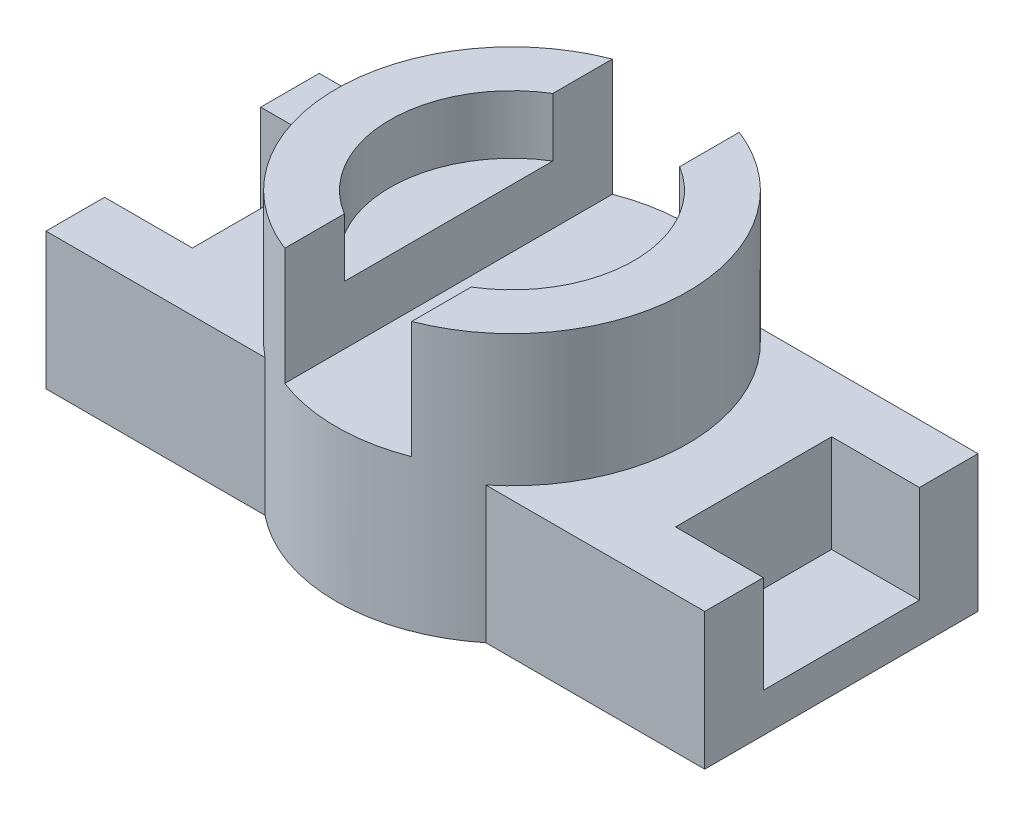
ISO-10303-21;
HEADER;
FILE_DESCRIPTION(('STEP AP214'),'2;1');
FILE_NAME('part.step','',(''),(''),'','','');
FILE_SCHEMA(('AUTOMOTIVE_DESIGN { 1 0 10303 214 1 1 1 1 }'));
ENDSEC;
DATA;
#1=APPLICATION_CONTEXT('core data for automotive mechanical design processes');
#2=APPLICATION_PROTOCOL_DEFINITION('international standard','automotive_design',2000,#1);
#3=PRODUCT_CONTEXT('',#1,'mechanical');
#4=PRODUCT('Part','Part','',(#3));
#5=PRODUCT_RELATED_PRODUCT_CATEGORY('part','',(#4));
#6=PRODUCT_DEFINITION_FORMATION('','',#4);
#7=PRODUCT_DEFINITION_CONTEXT('part definition',#1,'design');
#8=PRODUCT_DEFINITION('design','',#6,#7);
#9=PRODUCT_DEFINITION_SHAPE('','',#8);
#10=(LENGTH_UNIT() NAMED_UNIT(*) SI_UNIT(.MILLI.,.METRE.));
#11=(NAMED_UNIT(*) PLANE_ANGLE_UNIT() SI_UNIT($,.RADIAN.));
#12=(NAMED_UNIT(*) SI_UNIT($,.STERADIAN.) SOLID_ANGLE_UNIT());
#13=UNCERTAINTY_MEASURE_WITH_UNIT(LENGTH_MEASURE(1.E-05),#10,'distance_accuracy_value','');
#14=(GEOMETRIC_REPRESENTATION_CONTEXT(3) GLOBAL_UNCERTAINTY_ASSIGNED_CONTEXT((#13)) GLOBAL_UNIT_ASSIGNED_CONTEXT((#10,
#11,#12)) REPRESENTATION_CONTEXT('',''));
#15=CARTESIAN_POINT('',(0.,0.,0.));
#16=DIRECTION('',(0.,0.,1.));
#17=DIRECTION('',(1.,0.,0.));
#18=AXIS2_PLACEMENT_3D('',#15,#16,#17);
#19=CARTESIAN_POINT('',(0.,55.,0.));
#20=DIRECTION('',(0.,-1.,0.));
#21=DIRECTION('',(0.,0.,-1.));
#22=AXIS2_PLACEMENT_3D('',#19,#20,#21);
#23=CYLINDRICAL_SURFACE('',#22,36.);
#24=CARTESIAN_POINT('',(0.,0.,0.));
#25=DIRECTION('',(0.,1.,0.));
#26=DIRECTION('',(0.,0.,1.));
#27=AXIS2_PLACEMENT_3D('',#24,#25,#26);
#28=CIRCLE('',#27,36.);
#29=CARTESIAN_POINT('',(22.6274169979695,0.,-28.));
#30=VERTEX_POINT('',#29);
#31=CARTESIAN_POINT('',(-22.6274169979695,0.,-28.));
#32=VERTEX_POINT('',#31);
#33=EDGE_CURVE('E383',#30,#32,#28,.T.);
#34=ORIENTED_EDGE('',*,*,#33,.T.);
#35=DIRECTION('',(0.,-1.,0.));
#36=VECTOR('',#35,1.);
#37=CARTESIAN_POINT('',(-22.6274169979695,28.,-28.));
#38=LINE('',#37,#36);
#39=CARTESIAN_POINT('',(-22.6274169979695,28.,-28.));
#40=VERTEX_POINT('',#39);
#41=EDGE_CURVE('E372',#40,#32,#38,.T.);
#42=ORIENTED_EDGE('',*,*,#41,.F.);
#43=CARTESIAN_POINT('',(0.,28.,0.));
#44=DIRECTION('',(0.,1.,0.));
#45=DIRECTION('',(0.,0.,1.));
#46=AXIS2_PLACEMENT_3D('',#43,#44,#45);
#47=CIRCLE('',#46,36.);
#48=CARTESIAN_POINT('',(-22.6274169979695,28.,28.));
#49=VERTEX_POINT('',#48);
#50=EDGE_CURVE('E337',#40,#49,#47,.T.);
#51=ORIENTED_EDGE('',*,*,#50,.T.);
#52=DIRECTION('',(0.,-1.,0.));
#53=VECTOR('',#52,1.);
#54=CARTESIAN_POINT('',(-22.6274169979695,28.,28.));
#55=LINE('',#54,#53);
#56=CARTESIAN_POINT('',(-22.6274169979695,0.,28.));
#57=VERTEX_POINT('',#56);
#58=EDGE_CURVE('E352',#49,#57,#55,.T.);
#59=ORIENTED_EDGE('',*,*,#58,.T.);
#60=CARTESIAN_POINT('',(22.6274169979695,0.,28.));
#61=VERTEX_POINT('',#60);
#62=EDGE_CURVE('E376',#57,#61,#28,.T.);
#63=ORIENTED_EDGE('',*,*,#62,.T.);
#64=DIRECTION('',(0.,-1.,0.));
#65=VECTOR('',#64,1.);
#66=CARTESIAN_POINT('',(22.6274169979695,28.,28.));
#67=LINE('',#66,#65);
#68=CARTESIAN_POINT('',(22.6274169979695,28.,28.));
#69=VERTEX_POINT('',#68);
#70=EDGE_CURVE('E422',#69,#61,#67,.T.);
#71=ORIENTED_EDGE('',*,*,#70,.F.);
#72=CARTESIAN_POINT('',(0.,28.,0.));
#73=DIRECTION('',(0.,1.,0.));
#74=DIRECTION('',(0.,0.,1.));
#75=AXIS2_PLACEMENT_3D('',#72,#73,#74);
#76=CIRCLE('',#75,36.);
#77=CARTESIAN_POINT('',(22.6274169979695,28.,-28.));
#78=VERTEX_POINT('',#77);
#79=EDGE_CURVE('E386',#69,#78,#76,.T.);
#80=ORIENTED_EDGE('',*,*,#79,.T.);
#81=DIRECTION('',(0.,-1.,0.));
#82=VECTOR('',#81,1.);
#83=CARTESIAN_POINT('',(22.6274169979695,28.,-28.));
#84=LINE('',#83,#82);
#85=EDGE_CURVE('E402',#78,#30,#84,.T.);
#86=ORIENTED_EDGE('',*,*,#85,.T.);
#87=EDGE_LOOP('',(#34,#42,#51,#59,#63,#71,#80,#86));
#88=FACE_BOUND('',#87,.T.);
#89=DIRECTION('',(0.,-1.,0.));
#90=VECTOR('',#89,1.);
#91=CARTESIAN_POINT('',(13.,55.,-33.570820663189));
#92=LINE('',#91,#90);
#93=CARTESIAN_POINT('',(13.,55.,-33.570820663189));
#94=VERTEX_POINT('',#93);
#95=CARTESIAN_POINT('',(13.,31.,-33.570820663189));
#96=VERTEX_POINT('',#95);
#97=EDGE_CURVE('E323',#94,#96,#92,.T.);
#98=ORIENTED_EDGE('',*,*,#97,.F.);
#99=CARTESIAN_POINT('',(0.,55.,0.));
#100=DIRECTION('',(0.,1.,0.));
#101=DIRECTION('',(0.,0.,1.));
#102=AXIS2_PLACEMENT_3D('',#99,#100,#101);
#103=CIRCLE('',#102,36.);
#104=CARTESIAN_POINT('',(13.,55.,33.5708206631891));
#105=VERTEX_POINT('',#104);
#106=EDGE_CURVE('E377',#105,#94,#103,.T.);
#107=ORIENTED_EDGE('',*,*,#106,.F.);
#108=DIRECTION('',(0.,-1.,0.));
#109=VECTOR('',#108,1.);
#110=CARTESIAN_POINT('',(13.,55.,33.5708206631891));
#111=LINE('',#110,#109);
#112=CARTESIAN_POINT('',(13.,31.,33.570820663189));
#113=VERTEX_POINT('',#112);
#114=EDGE_CURVE('E320',#113,#105,#111,.F.);
#115=ORIENTED_EDGE('',*,*,#114,.F.);
#116=CARTESIAN_POINT('',(0.,31.,0.));
#117=DIRECTION('',(0.,1.,0.));
#118=DIRECTION('',(0.,0.,1.));
#119=AXIS2_PLACEMENT_3D('',#116,#117,#118);
#120=CIRCLE('',#119,36.);
#121=CARTESIAN_POINT('',(-13.,31.,33.570820663189));
#122=VERTEX_POINT('',#121);
#123=EDGE_CURVE('E51',#122,#113,#120,.T.);
#124=ORIENTED_EDGE('',*,*,#123,.F.);
#125=DIRECTION('',(0.,-1.,0.));
#126=VECTOR('',#125,1.);
#127=CARTESIAN_POINT('',(-13.,55.,33.570820663189));
#128=LINE('',#127,#126);
#129=CARTESIAN_POINT('',(-13.,55.,33.570820663189));
#130=VERTEX_POINT('',#129);
#131=EDGE_CURVE('E306',#122,#130,#128,.F.);
#132=ORIENTED_EDGE('',*,*,#131,.T.);
#133=CARTESIAN_POINT('',(-13.,55.,-33.570820663189));
#134=VERTEX_POINT('',#133);
#135=EDGE_CURVE('E382',#134,#130,#103,.T.);
#136=ORIENTED_EDGE('',*,*,#135,.F.);
#137=DIRECTION('',(0.,-1.,0.));
#138=VECTOR('',#137,1.);
#139=CARTESIAN_POINT('',(-13.,55.,-33.570820663189));
#140=LINE('',#139,#138);
#141=CARTESIAN_POINT('',(-13.,31.,-33.570820663189));
#142=VERTEX_POINT('',#141);
#143=EDGE_CURVE('E310',#134,#142,#140,.T.);
#144=ORIENTED_EDGE('',*,*,#143,.T.);
#145=EDGE_CURVE('E11',#96,#142,#120,.T.);
#146=ORIENTED_EDGE('',*,*,#145,.F.);
#147=EDGE_LOOP('',(#98,#107,#115,#124,#132,#136,#144,#146));
#148=FACE_BOUND('',#147,.T.);
#149=ADVANCED_FACE('F47',(#88,#148),#23,.T.);
#150=CARTESIAN_POINT('',(0.,55.,0.));
#151=DIRECTION('',(0.,1.,0.));
#152=DIRECTION('',(0.,0.,1.));
#153=AXIS2_PLACEMENT_3D('',#150,#151,#152);
#154=PLANE('',#153);
#155=ORIENTED_EDGE('',*,*,#106,.T.);
#156=DIRECTION('',(0.,0.,-1.));
#157=VECTOR('',#156,1.);
#158=CARTESIAN_POINT('',(13.,55.,42.8234924623116));
#159=LINE('',#158,#157);
#160=CARTESIAN_POINT('',(13.,55.,-21.3541565040626));
#161=VERTEX_POINT('',#160);
#162=EDGE_CURVE('E280',#161,#94,#159,.T.);
#163=ORIENTED_EDGE('',*,*,#162,.F.);
#164=CARTESIAN_POINT('',(0.,55.,0.));
#165=DIRECTION('',(0.,1.,0.));
#166=DIRECTION('',(0.,0.,1.));
#167=AXIS2_PLACEMENT_3D('',#164,#165,#166);
#168=CIRCLE('',#167,25.);
#169=CARTESIAN_POINT('',(13.,55.,21.3541565040626));
#170=VERTEX_POINT('',#169);
#171=EDGE_CURVE('E333',#170,#161,#168,.T.);
#172=ORIENTED_EDGE('',*,*,#171,.F.);
#173=EDGE_CURVE('E283',#105,#170,#159,.T.);
#174=ORIENTED_EDGE('',*,*,#173,.F.);
#175=EDGE_LOOP('',(#155,#163,#172,#174));
#176=FACE_BOUND('',#175,.T.);
#177=ADVANCED_FACE('F449',(#176),#154,.T.);
#178=CARTESIAN_POINT('',(0.,43.,0.));
#179=DIRECTION('',(0.,1.,0.));
#180=DIRECTION('',(0.,0.,1.));
#181=AXIS2_PLACEMENT_3D('',#178,#179,#180);
#182=CYLINDRICAL_SURFACE('',#181,25.);
#183=DIRECTION('',(0.,1.,0.));
#184=VECTOR('',#183,1.);
#185=CARTESIAN_POINT('',(13.,43.,21.3541565040626));
#186=LINE('',#185,#184);
#187=CARTESIAN_POINT('',(13.,43.,21.3541565040626));
#188=VERTEX_POINT('',#187);
#189=EDGE_CURVE('E317',#170,#188,#186,.F.);
#190=ORIENTED_EDGE('',*,*,#189,.F.);
#191=ORIENTED_EDGE('',*,*,#171,.T.);
#192=DIRECTION('',(0.,1.,0.));
#193=VECTOR('',#192,1.);
#194=CARTESIAN_POINT('',(13.,43.,-21.3541565040626));
#195=LINE('',#194,#193);
#196=CARTESIAN_POINT('',(13.,43.,-21.3541565040626));
#197=VERTEX_POINT('',#196);
#198=EDGE_CURVE('E314',#197,#161,#195,.T.);
#199=ORIENTED_EDGE('',*,*,#198,.F.);
#200=CARTESIAN_POINT('',(0.,43.,0.));
#201=DIRECTION('',(0.,1.,0.));
#202=DIRECTION('',(0.,0.,1.));
#203=AXIS2_PLACEMENT_3D('',#200,#201,#202);
#204=CIRCLE('',#203,25.);
#205=EDGE_CURVE('E327',#188,#197,#204,.T.);
#206=ORIENTED_EDGE('',*,*,#205,.F.);
#207=EDGE_LOOP('',(#190,#191,#199,#206));
#208=FACE_BOUND('',#207,.T.);
#209=ADVANCED_FACE('F506',(#208),#182,.F.);
#210=CARTESIAN_POINT('',(0.,43.,0.));
#211=DIRECTION('',(0.,1.,0.));
#212=DIRECTION('',(0.,0.,1.));
#213=AXIS2_PLACEMENT_3D('',#210,#211,#212);
#214=PLANE('',#213);
#215=ORIENTED_EDGE('',*,*,#205,.T.);
#216=DIRECTION('',(0.,0.,1.));
#217=VECTOR('',#216,1.);
#218=CARTESIAN_POINT('',(13.,43.,0.));
#219=LINE('',#218,#217);
#220=EDGE_CURVE('E428',#197,#188,#219,.T.);
#221=ORIENTED_EDGE('',*,*,#220,.T.);
#222=EDGE_LOOP('',(#215,#221));
#223=FACE_BOUND('',#222,.T.);
#224=ADVANCED_FACE('F499',(#223),#214,.T.);
#225=CARTESIAN_POINT('',(0.,28.,28.));
#226=DIRECTION('',(0.,0.,-1.));
#227=DIRECTION('',(-1.,0.,0.));
#228=AXIS2_PLACEMENT_3D('',#225,#226,#227);
#229=PLANE('',#228);
#230=DIRECTION('',(1.,0.,0.));
#231=VECTOR('',#230,1.);
#232=CARTESIAN_POINT('',(0.,0.,28.));
#233=LINE('',#232,#231);
#234=CARTESIAN_POINT('',(67.5,0.,28.));
#235=VERTEX_POINT('',#234);
#236=EDGE_CURVE('E381',#61,#235,#233,.T.);
#237=ORIENTED_EDGE('',*,*,#236,.T.);
#238=DIRECTION('',(0.,-1.,0.));
#239=VECTOR('',#238,1.);
#240=CARTESIAN_POINT('',(67.5,28.,28.));
#241=LINE('',#240,#239);
#242=CARTESIAN_POINT('',(67.5,28.,28.));
#243=VERTEX_POINT('',#242);
#244=EDGE_CURVE('E418',#243,#235,#241,.T.);
#245=ORIENTED_EDGE('',*,*,#244,.F.);
#246=DIRECTION('',(1.,0.,0.));
#247=VECTOR('',#246,1.);
#248=CARTESIAN_POINT('',(0.,28.,28.));
#249=LINE('',#248,#247);
#250=EDGE_CURVE('E389',#69,#243,#249,.T.);
#251=ORIENTED_EDGE('',*,*,#250,.F.);
#252=ORIENTED_EDGE('',*,*,#70,.T.);
#253=EDGE_LOOP('',(#237,#245,#251,#252));
#254=FACE_BOUND('',#253,.T.);
#255=ADVANCED_FACE('F49',(#254),#229,.F.);
#256=CARTESIAN_POINT('',(67.5,28.,0.));
#257=DIRECTION('',(-1.,0.,0.));
#258=DIRECTION('',(0.,0.,1.));
#259=AXIS2_PLACEMENT_3D('',#256,#257,#258);
#260=PLANE('',#259);
#261=DIRECTION('',(0.,0.,-1.));
#262=VECTOR('',#261,1.);
#263=CARTESIAN_POINT('',(67.5,28.,0.));
#264=LINE('',#263,#262);
#265=CARTESIAN_POINT('',(67.5000000000001,28.,-16.));
#266=VERTEX_POINT('',#265);
#267=CARTESIAN_POINT('',(67.4999999999999,28.,-28.));
#268=VERTEX_POINT('',#267);
#269=EDGE_CURVE('E393',#266,#268,#264,.T.);
#270=ORIENTED_EDGE('',*,*,#269,.F.);
#271=DIRECTION('',(0.,1.,0.));
#272=VECTOR('',#271,1.);
#273=CARTESIAN_POINT('',(67.5000000000001,8.,-16.));
#274=LINE('',#273,#272);
#275=CARTESIAN_POINT('',(67.5000000000001,8.,-16.));
#276=VERTEX_POINT('',#275);
#277=EDGE_CURVE('E252',#276,#266,#274,.T.);
#278=ORIENTED_EDGE('',*,*,#277,.F.);
#279=DIRECTION('',(0.,0.,-1.));
#280=VECTOR('',#279,1.);
#281=CARTESIAN_POINT('',(67.5000000000001,8.,-16.));
#282=LINE('',#281,#280);
#283=CARTESIAN_POINT('',(67.5000000000001,8.,16.));
#284=VERTEX_POINT('',#283);
#285=EDGE_CURVE('E244',#284,#276,#282,.T.);
#286=ORIENTED_EDGE('',*,*,#285,.F.);
#287=DIRECTION('',(0.,1.,0.));
#288=VECTOR('',#287,1.);
#289=CARTESIAN_POINT('',(67.5000000000001,8.,16.));
#290=LINE('',#289,#288);
#291=CARTESIAN_POINT('',(67.5000000000001,28.,16.));
#292=VERTEX_POINT('',#291);
#293=EDGE_CURVE('E248',#284,#292,#290,.T.);
#294=ORIENTED_EDGE('',*,*,#293,.T.);
#295=EDGE_CURVE('E394',#243,#292,#264,.T.);
#296=ORIENTED_EDGE('',*,*,#295,.F.);
#297=ORIENTED_EDGE('',*,*,#244,.T.);
#298=DIRECTION('',(0.,0.,-1.));
#299=VECTOR('',#298,1.);
#300=CARTESIAN_POINT('',(67.5,0.,0.));
#301=LINE('',#300,#299);
#302=CARTESIAN_POINT('',(67.4999999999999,0.,-28.));
#303=VERTEX_POINT('',#302);
#304=EDGE_CURVE('E405',#235,#303,#301,.T.);
#305=ORIENTED_EDGE('',*,*,#304,.T.);
#306=DIRECTION('',(0.,-1.,0.));
#307=VECTOR('',#306,1.);
#308=CARTESIAN_POINT('',(67.4999999999999,28.,-28.));
#309=LINE('',#308,#307);
#310=EDGE_CURVE('E415',#268,#303,#309,.T.);
#311=ORIENTED_EDGE('',*,*,#310,.F.);
#312=EDGE_LOOP('',(#270,#278,#286,#294,#296,#297,#305,#311));
#313=FACE_BOUND('',#312,.T.);
#314=ADVANCED_FACE('F529',(#313),#260,.F.);
#315=CARTESIAN_POINT('',(0.,28.,-28.));
#316=DIRECTION('',(0.,0.,-1.));
#317=DIRECTION('',(-1.,0.,0.));
#318=AXIS2_PLACEMENT_3D('',#315,#316,#317);
#319=PLANE('',#318);
#320=DIRECTION('',(1.,0.,0.));
#321=VECTOR('',#320,1.);
#322=CARTESIAN_POINT('',(0.,0.,-28.));
#323=LINE('',#322,#321);
#324=EDGE_CURVE('E390',#30,#303,#323,.T.);
#325=ORIENTED_EDGE('',*,*,#324,.F.);
#326=ORIENTED_EDGE('',*,*,#85,.F.);
#327=DIRECTION('',(1.,0.,0.));
#328=VECTOR('',#327,1.);
#329=CARTESIAN_POINT('',(0.,28.,-28.));
#330=LINE('',#329,#328);
#331=EDGE_CURVE('E398',#78,#268,#330,.T.);
#332=ORIENTED_EDGE('',*,*,#331,.T.);
#333=ORIENTED_EDGE('',*,*,#310,.T.);
#334=EDGE_LOOP('',(#325,#326,#332,#333));
#335=FACE_BOUND('',#334,.T.);
#336=ADVANCED_FACE('F523',(#335),#319,.T.);
#337=CARTESIAN_POINT('',(0.,28.,0.));
#338=DIRECTION('',(0.,1.,0.));
#339=DIRECTION('',(0.,0.,1.));
#340=AXIS2_PLACEMENT_3D('',#337,#338,#339);
#341=PLANE('',#340);
#342=DIRECTION('',(-1.,0.,0.));
#343=VECTOR('',#342,1.);
#344=CARTESIAN_POINT('',(67.5000000000001,28.,-16.));
#345=LINE('',#344,#343);
#346=CARTESIAN_POINT('',(49.5000000000001,28.,-16.));
#347=VERTEX_POINT('',#346);
#348=EDGE_CURVE('E63',#266,#347,#345,.T.);
#349=ORIENTED_EDGE('',*,*,#348,.F.);
#350=ORIENTED_EDGE('',*,*,#269,.T.);
#351=ORIENTED_EDGE('',*,*,#331,.F.);
#352=ORIENTED_EDGE('',*,*,#79,.F.);
#353=ORIENTED_EDGE('',*,*,#250,.T.);
#354=ORIENTED_EDGE('',*,*,#295,.T.);
#355=DIRECTION('',(1.,0.,0.));
#356=VECTOR('',#355,1.);
#357=CARTESIAN_POINT('',(67.5000000000001,28.,16.));
#358=LINE('',#357,#356);
#359=CARTESIAN_POINT('',(49.5,28.,16.));
#360=VERTEX_POINT('',#359);
#361=EDGE_CURVE('E255',#360,#292,#358,.T.);
#362=ORIENTED_EDGE('',*,*,#361,.F.);
#363=DIRECTION('',(0.,0.,1.));
#364=VECTOR('',#363,1.);
#365=CARTESIAN_POINT('',(49.5000000000001,28.,-16.));
#366=LINE('',#365,#364);
#367=EDGE_CURVE('E258',#347,#360,#366,.T.);
#368=ORIENTED_EDGE('',*,*,#367,.F.);
#369=EDGE_LOOP('',(#349,#350,#351,#352,#353,#354,#362,#368));
#370=FACE_BOUND('',#369,.T.);
#371=ADVANCED_FACE('F519',(#370),#341,.T.);
#372=CARTESIAN_POINT('',(0.,0.,0.));
#373=DIRECTION('',(0.,1.,0.));
#374=DIRECTION('',(0.,0.,1.));
#375=AXIS2_PLACEMENT_3D('',#372,#373,#374);
#376=PLANE('',#375);
#377=ORIENTED_EDGE('',*,*,#236,.F.);
#378=ORIENTED_EDGE('',*,*,#62,.F.);
#379=DIRECTION('',(1.,0.,0.));
#380=VECTOR('',#379,1.);
#381=CARTESIAN_POINT('',(0.,0.,28.));
#382=LINE('',#381,#380);
#383=CARTESIAN_POINT('',(-67.5,0.,28.));
#384=VERTEX_POINT('',#383);
#385=EDGE_CURVE('E341',#384,#57,#382,.T.);
#386=ORIENTED_EDGE('',*,*,#385,.F.);
#387=DIRECTION('',(0.,0.,-1.));
#388=VECTOR('',#387,1.);
#389=CARTESIAN_POINT('',(-67.5,0.,0.));
#390=LINE('',#389,#388);
#391=CARTESIAN_POINT('',(-67.5,0.,-28.));
#392=VERTEX_POINT('',#391);
#393=EDGE_CURVE('E356',#384,#392,#390,.T.);
#394=ORIENTED_EDGE('',*,*,#393,.T.);
#395=DIRECTION('',(1.,0.,0.));
#396=VECTOR('',#395,1.);
#397=CARTESIAN_POINT('',(0.,0.,-28.));
#398=LINE('',#397,#396);
#399=EDGE_CURVE('E331',#392,#32,#398,.T.);
#400=ORIENTED_EDGE('',*,*,#399,.T.);
#401=ORIENTED_EDGE('',*,*,#33,.F.);
#402=ORIENTED_EDGE('',*,*,#324,.T.);
#403=ORIENTED_EDGE('',*,*,#304,.F.);
#404=EDGE_LOOP('',(#377,#378,#386,#394,#400,#401,#402,#403));
#405=FACE_BOUND('',#404,.T.);
#406=ADVANCED_FACE('F522',(#405),#376,.F.);
#407=DIRECTION('',(0.,0.,-1.));
#408=VECTOR('',#407,1.);
#409=CARTESIAN_POINT('',(-13.,55.,42.8234924623116));
#410=LINE('',#409,#408);
#411=CARTESIAN_POINT('',(-13.,55.,-21.3541565040626));
#412=VERTEX_POINT('',#411);
#413=EDGE_CURVE('E285',#412,#134,#410,.T.);
#414=ORIENTED_EDGE('',*,*,#413,.T.);
#415=ORIENTED_EDGE('',*,*,#135,.T.);
#416=CARTESIAN_POINT('',(-13.,55.,21.3541565040626));
#417=VERTEX_POINT('',#416);
#418=EDGE_CURVE('E289',#130,#417,#410,.T.);
#419=ORIENTED_EDGE('',*,*,#418,.T.);
#420=EDGE_CURVE('E326',#412,#417,#168,.T.);
#421=ORIENTED_EDGE('',*,*,#420,.F.);
#422=EDGE_LOOP('',(#414,#415,#419,#421));
#423=FACE_BOUND('',#422,.T.);
#424=ADVANCED_FACE('F487',(#423),#154,.T.);
#425=CARTESIAN_POINT('',(0.,28.,-28.));
#426=DIRECTION('',(0.,0.,-1.));
#427=DIRECTION('',(-1.,0.,0.));
#428=AXIS2_PLACEMENT_3D('',#425,#426,#427);
#429=PLANE('',#428);
#430=ORIENTED_EDGE('',*,*,#399,.F.);
#431=DIRECTION('',(0.,-1.,0.));
#432=VECTOR('',#431,1.);
#433=CARTESIAN_POINT('',(-67.5,28.,-28.));
#434=LINE('',#433,#432);
#435=CARTESIAN_POINT('',(-67.5,28.,-28.));
#436=VERTEX_POINT('',#435);
#437=EDGE_CURVE('E369',#436,#392,#434,.T.);
#438=ORIENTED_EDGE('',*,*,#437,.F.);
#439=DIRECTION('',(1.,0.,0.));
#440=VECTOR('',#439,1.);
#441=CARTESIAN_POINT('',(0.,28.,-28.));
#442=LINE('',#441,#440);
#443=EDGE_CURVE('E340',#436,#40,#442,.T.);
#444=ORIENTED_EDGE('',*,*,#443,.T.);
#445=ORIENTED_EDGE('',*,*,#41,.T.);
#446=EDGE_LOOP('',(#430,#438,#444,#445));
#447=FACE_BOUND('',#446,.T.);
#448=ADVANCED_FACE('F560',(#447),#429,.T.);
#449=CARTESIAN_POINT('',(-67.5,28.,0.));
#450=DIRECTION('',(-1.,0.,0.));
#451=DIRECTION('',(0.,0.,1.));
#452=AXIS2_PLACEMENT_3D('',#449,#450,#451);
#453=PLANE('',#452);
#454=DIRECTION('',(0.,1.,0.));
#455=VECTOR('',#454,1.);
#456=CARTESIAN_POINT('',(-67.5,8.,-16.));
#457=LINE('',#456,#455);
#458=CARTESIAN_POINT('',(-67.5,8.,-16.));
#459=VERTEX_POINT('',#458);
#460=CARTESIAN_POINT('',(-67.5,28.,-16.));
#461=VERTEX_POINT('',#460);
#462=EDGE_CURVE('E294',#459,#461,#457,.T.);
#463=ORIENTED_EDGE('',*,*,#462,.T.);
#464=DIRECTION('',(0.,0.,-1.));
#465=VECTOR('',#464,1.);
#466=CARTESIAN_POINT('',(-67.5,28.,0.));
#467=LINE('',#466,#465);
#468=EDGE_CURVE('E345',#461,#436,#467,.T.);
#469=ORIENTED_EDGE('',*,*,#468,.T.);
#470=ORIENTED_EDGE('',*,*,#437,.T.);
#471=ORIENTED_EDGE('',*,*,#393,.F.);
#472=DIRECTION('',(0.,-1.,0.));
#473=VECTOR('',#472,1.);
#474=CARTESIAN_POINT('',(-67.5,28.,28.));
#475=LINE('',#474,#473);
#476=CARTESIAN_POINT('',(-67.5,28.,28.));
#477=VERTEX_POINT('',#476);
#478=EDGE_CURVE('E366',#477,#384,#475,.T.);
#479=ORIENTED_EDGE('',*,*,#478,.F.);
#480=CARTESIAN_POINT('',(-67.5,28.,16.));
#481=VERTEX_POINT('',#480);
#482=EDGE_CURVE('E231',#477,#481,#467,.T.);
#483=ORIENTED_EDGE('',*,*,#482,.T.);
#484=DIRECTION('',(0.,1.,0.));
#485=VECTOR('',#484,1.);
#486=CARTESIAN_POINT('',(-67.5,8.,16.));
#487=LINE('',#486,#485);
#488=CARTESIAN_POINT('',(-67.5,8.,16.));
#489=VERTEX_POINT('',#488);
#490=EDGE_CURVE('E71',#489,#481,#487,.T.);
#491=ORIENTED_EDGE('',*,*,#490,.F.);
#492=DIRECTION('',(0.,0.,1.));
#493=VECTOR('',#492,1.);
#494=CARTESIAN_POINT('',(-67.5,8.,-16.));
#495=LINE('',#494,#493);
#496=EDGE_CURVE('E216',#459,#489,#495,.T.);
#497=ORIENTED_EDGE('',*,*,#496,.F.);
#498=EDGE_LOOP('',(#463,#469,#470,#471,#479,#483,#491,#497));
#499=FACE_BOUND('',#498,.T.);
#500=ADVANCED_FACE('F229',(#499),#453,.T.);
#501=CARTESIAN_POINT('',(0.,28.,28.));
#502=DIRECTION('',(0.,0.,-1.));
#503=DIRECTION('',(-1.,0.,0.));
#504=AXIS2_PLACEMENT_3D('',#501,#502,#503);
#505=PLANE('',#504);
#506=ORIENTED_EDGE('',*,*,#385,.T.);
#507=ORIENTED_EDGE('',*,*,#58,.F.);
#508=DIRECTION('',(1.,0.,0.));
#509=VECTOR('',#508,1.);
#510=CARTESIAN_POINT('',(0.,28.,28.));
#511=LINE('',#510,#509);
#512=EDGE_CURVE('E348',#477,#49,#511,.T.);
#513=ORIENTED_EDGE('',*,*,#512,.F.);
#514=ORIENTED_EDGE('',*,*,#478,.T.);
#515=EDGE_LOOP('',(#506,#507,#513,#514));
#516=FACE_BOUND('',#515,.T.);
#517=ADVANCED_FACE('F564',(#516),#505,.F.);
#518=CARTESIAN_POINT('',(0.,28.,0.));
#519=DIRECTION('',(0.,1.,0.));
#520=DIRECTION('',(0.,0.,1.));
#521=AXIS2_PLACEMENT_3D('',#518,#519,#520);
#522=PLANE('',#521);
#523=DIRECTION('',(-1.,0.,0.));
#524=VECTOR('',#523,1.);
#525=CARTESIAN_POINT('',(-67.5,28.,-16.));
#526=LINE('',#525,#524);
#527=CARTESIAN_POINT('',(-49.5,28.,-16.));
#528=VERTEX_POINT('',#527);
#529=EDGE_CURVE('E226',#528,#461,#526,.T.);
#530=ORIENTED_EDGE('',*,*,#529,.F.);
#531=DIRECTION('',(0.,0.,-1.));
#532=VECTOR('',#531,1.);
#533=CARTESIAN_POINT('',(-49.5,28.,-16.));
#534=LINE('',#533,#532);
#535=CARTESIAN_POINT('',(-49.5,28.,16.));
#536=VERTEX_POINT('',#535);
#537=EDGE_CURVE('E462',#536,#528,#534,.T.);
#538=ORIENTED_EDGE('',*,*,#537,.F.);
#539=DIRECTION('',(1.,0.,0.));
#540=VECTOR('',#539,1.);
#541=CARTESIAN_POINT('',(-67.5,28.,16.));
#542=LINE('',#541,#540);
#543=EDGE_CURVE('E265',#481,#536,#542,.T.);
#544=ORIENTED_EDGE('',*,*,#543,.F.);
#545=ORIENTED_EDGE('',*,*,#482,.F.);
#546=ORIENTED_EDGE('',*,*,#512,.T.);
#547=ORIENTED_EDGE('',*,*,#50,.F.);
#548=ORIENTED_EDGE('',*,*,#443,.F.);
#549=ORIENTED_EDGE('',*,*,#468,.F.);
#550=EDGE_LOOP('',(#530,#538,#544,#545,#546,#547,#548,#549));
#551=FACE_BOUND('',#550,.T.);
#552=ADVANCED_FACE('F475',(#551),#522,.T.);
#553=ORIENTED_EDGE('',*,*,#420,.T.);
#554=DIRECTION('',(0.,1.,0.));
#555=VECTOR('',#554,1.);
#556=CARTESIAN_POINT('',(-13.,43.,21.3541565040626));
#557=LINE('',#556,#555);
#558=CARTESIAN_POINT('',(-13.,43.,21.3541565040626));
#559=VERTEX_POINT('',#558);
#560=EDGE_CURVE('E302',#417,#559,#557,.F.);
#561=ORIENTED_EDGE('',*,*,#560,.T.);
#562=CARTESIAN_POINT('',(-13.,43.,-21.3541565040626));
#563=VERTEX_POINT('',#562);
#564=EDGE_CURVE('E332',#563,#559,#204,.T.);
#565=ORIENTED_EDGE('',*,*,#564,.F.);
#566=DIRECTION('',(0.,1.,0.));
#567=VECTOR('',#566,1.);
#568=CARTESIAN_POINT('',(-13.,43.,-21.3541565040626));
#569=LINE('',#568,#567);
#570=EDGE_CURVE('E298',#563,#412,#569,.T.);
#571=ORIENTED_EDGE('',*,*,#570,.T.);
#572=EDGE_LOOP('',(#553,#561,#565,#571));
#573=FACE_BOUND('',#572,.T.);
#574=ADVANCED_FACE('F491',(#573),#182,.F.);
#575=DIRECTION('',(0.,0.,1.));
#576=VECTOR('',#575,1.);
#577=CARTESIAN_POINT('',(-13.,43.,0.));
#578=LINE('',#577,#576);
#579=EDGE_CURVE('E426',#563,#559,#578,.T.);
#580=ORIENTED_EDGE('',*,*,#579,.F.);
#581=ORIENTED_EDGE('',*,*,#564,.T.);
#582=EDGE_LOOP('',(#580,#581));
#583=FACE_BOUND('',#582,.T.);
#584=ADVANCED_FACE('F496',(#583),#214,.T.);
#585=CARTESIAN_POINT('',(0.,31.,0.));
#586=DIRECTION('',(0.,1.,0.));
#587=DIRECTION('',(0.,0.,1.));
#588=AXIS2_PLACEMENT_3D('',#585,#586,#587);
#589=PLANE('',#588);
#590=ORIENTED_EDGE('',*,*,#145,.T.);
#591=DIRECTION('',(0.,0.,-1.));
#592=VECTOR('',#591,1.);
#593=CARTESIAN_POINT('',(-13.,31.,42.8234924623116));
#594=LINE('',#593,#592);
#595=EDGE_CURVE('E284',#122,#142,#594,.T.);
#596=ORIENTED_EDGE('',*,*,#595,.F.);
#597=ORIENTED_EDGE('',*,*,#123,.T.);
#598=DIRECTION('',(0.,0.,-1.));
#599=VECTOR('',#598,1.);
#600=CARTESIAN_POINT('',(13.,31.,42.8234924623116));
#601=LINE('',#600,#599);
#602=EDGE_CURVE('E290',#113,#96,#601,.T.);
#603=ORIENTED_EDGE('',*,*,#602,.T.);
#604=EDGE_LOOP('',(#590,#596,#597,#603));
#605=FACE_BOUND('',#604,.T.);
#606=ADVANCED_FACE('F438',(#605),#589,.T.);
#607=CARTESIAN_POINT('',(13.,55.,42.8234924623116));
#608=DIRECTION('',(-1.,0.,0.));
#609=DIRECTION('',(0.,0.,1.));
#610=AXIS2_PLACEMENT_3D('',#607,#608,#609);
#611=PLANE('',#610);
#612=ORIENTED_EDGE('',*,*,#97,.T.);
#613=ORIENTED_EDGE('',*,*,#602,.F.);
#614=ORIENTED_EDGE('',*,*,#114,.T.);
#615=ORIENTED_EDGE('',*,*,#173,.T.);
#616=ORIENTED_EDGE('',*,*,#189,.T.);
#617=ORIENTED_EDGE('',*,*,#220,.F.);
#618=ORIENTED_EDGE('',*,*,#198,.T.);
#619=ORIENTED_EDGE('',*,*,#162,.T.);
#620=EDGE_LOOP('',(#612,#613,#614,#615,#616,#617,#618,#619));
#621=FACE_BOUND('',#620,.T.);
#622=ADVANCED_FACE('F443',(#621),#611,.T.);
#623=CARTESIAN_POINT('',(-13.,55.,42.8234924623116));
#624=DIRECTION('',(-1.,0.,0.));
#625=DIRECTION('',(0.,0.,1.));
#626=AXIS2_PLACEMENT_3D('',#623,#624,#625);
#627=PLANE('',#626);
#628=ORIENTED_EDGE('',*,*,#413,.F.);
#629=ORIENTED_EDGE('',*,*,#570,.F.);
#630=ORIENTED_EDGE('',*,*,#579,.T.);
#631=ORIENTED_EDGE('',*,*,#560,.F.);
#632=ORIENTED_EDGE('',*,*,#418,.F.);
#633=ORIENTED_EDGE('',*,*,#131,.F.);
#634=ORIENTED_EDGE('',*,*,#595,.T.);
#635=ORIENTED_EDGE('',*,*,#143,.F.);
#636=EDGE_LOOP('',(#628,#629,#630,#631,#632,#633,#634,#635));
#637=FACE_BOUND('',#636,.T.);
#638=ADVANCED_FACE('F494',(#637),#627,.F.);
#639=CARTESIAN_POINT('',(-67.5,8.,-16.));
#640=DIRECTION('',(0.,0.,-1.));
#641=DIRECTION('',(-1.,0.,0.));
#642=AXIS2_PLACEMENT_3D('',#639,#640,#641);
#643=PLANE('',#642);
#644=ORIENTED_EDGE('',*,*,#529,.T.);
#645=ORIENTED_EDGE('',*,*,#462,.F.);
#646=DIRECTION('',(-1.,0.,0.));
#647=VECTOR('',#646,1.);
#648=CARTESIAN_POINT('',(-67.5,8.,-16.));
#649=LINE('',#648,#647);
#650=CARTESIAN_POINT('',(-49.5,8.,-16.));
#651=VERTEX_POINT('',#650);
#652=EDGE_CURVE('E222',#651,#459,#649,.T.);
#653=ORIENTED_EDGE('',*,*,#652,.F.);
#654=DIRECTION('',(0.,1.,0.));
#655=VECTOR('',#654,1.);
#656=CARTESIAN_POINT('',(-49.5,8.,-16.));
#657=LINE('',#656,#655);
#658=EDGE_CURVE('E236',#651,#528,#657,.T.);
#659=ORIENTED_EDGE('',*,*,#658,.T.);
#660=EDGE_LOOP('',(#644,#645,#653,#659));
#661=FACE_BOUND('',#660,.T.);
#662=ADVANCED_FACE('F469',(#661),#643,.F.);
#663=CARTESIAN_POINT('',(-49.5,8.,-16.));
#664=DIRECTION('',(1.,0.,0.));
#665=DIRECTION('',(0.,0.,-1.));
#666=AXIS2_PLACEMENT_3D('',#663,#664,#665);
#667=PLANE('',#666);
#668=ORIENTED_EDGE('',*,*,#537,.T.);
#669=ORIENTED_EDGE('',*,*,#658,.F.);
#670=DIRECTION('',(0.,0.,-1.));
#671=VECTOR('',#670,1.);
#672=CARTESIAN_POINT('',(-49.5,8.,-16.));
#673=LINE('',#672,#671);
#674=CARTESIAN_POINT('',(-49.5,8.,16.));
#675=VERTEX_POINT('',#674);
#676=EDGE_CURVE('E215',#675,#651,#673,.T.);
#677=ORIENTED_EDGE('',*,*,#676,.F.);
#678=DIRECTION('',(0.,1.,0.));
#679=VECTOR('',#678,1.);
#680=CARTESIAN_POINT('',(-49.5,8.,16.));
#681=LINE('',#680,#679);
#682=EDGE_CURVE('E210',#675,#536,#681,.T.);
#683=ORIENTED_EDGE('',*,*,#682,.T.);
#684=EDGE_LOOP('',(#668,#669,#677,#683));
#685=FACE_BOUND('',#684,.T.);
#686=ADVANCED_FACE('F565',(#685),#667,.F.);
#687=CARTESIAN_POINT('',(-67.5,8.,16.));
#688=DIRECTION('',(0.,0.,1.));
#689=DIRECTION('',(1.,0.,0.));
#690=AXIS2_PLACEMENT_3D('',#687,#688,#689);
#691=PLANE('',#690);
#692=ORIENTED_EDGE('',*,*,#543,.T.);
#693=ORIENTED_EDGE('',*,*,#682,.F.);
#694=DIRECTION('',(1.,0.,0.));
#695=VECTOR('',#694,1.);
#696=CARTESIAN_POINT('',(-67.5,8.,16.));
#697=LINE('',#696,#695);
#698=EDGE_CURVE('E207',#489,#675,#697,.T.);
#699=ORIENTED_EDGE('',*,*,#698,.F.);
#700=ORIENTED_EDGE('',*,*,#490,.T.);
#701=EDGE_LOOP('',(#692,#693,#699,#700));
#702=FACE_BOUND('',#701,.T.);
#703=ADVANCED_FACE('F209',(#702),#691,.F.);
#704=CARTESIAN_POINT('',(0.,8.,0.));
#705=DIRECTION('',(0.,1.,0.));
#706=DIRECTION('',(0.,0.,1.));
#707=AXIS2_PLACEMENT_3D('',#704,#705,#706);
#708=PLANE('',#707);
#709=ORIENTED_EDGE('',*,*,#496,.T.);
#710=ORIENTED_EDGE('',*,*,#698,.T.);
#711=ORIENTED_EDGE('',*,*,#676,.T.);
#712=ORIENTED_EDGE('',*,*,#652,.T.);
#713=EDGE_LOOP('',(#709,#710,#711,#712));
#714=FACE_BOUND('',#713,.T.);
#715=ADVANCED_FACE('F220',(#714),#708,.T.);
#716=CARTESIAN_POINT('',(67.5000000000001,8.,-16.));
#717=DIRECTION('',(0.,0.,-1.));
#718=DIRECTION('',(-1.,0.,0.));
#719=AXIS2_PLACEMENT_3D('',#716,#717,#718);
#720=PLANE('',#719);
#721=ORIENTED_EDGE('',*,*,#348,.T.);
#722=DIRECTION('',(0.,1.,0.));
#723=VECTOR('',#722,1.);
#724=CARTESIAN_POINT('',(49.5000000000001,8.,-16.));
#725=LINE('',#724,#723);
#726=CARTESIAN_POINT('',(49.5000000000001,8.,-16.));
#727=VERTEX_POINT('',#726);
#728=EDGE_CURVE('E241',#727,#347,#725,.T.);
#729=ORIENTED_EDGE('',*,*,#728,.F.);
#730=DIRECTION('',(-1.,0.,0.));
#731=VECTOR('',#730,1.);
#732=CARTESIAN_POINT('',(67.5000000000001,8.,-16.));
#733=LINE('',#732,#731);
#734=EDGE_CURVE('E259',#276,#727,#733,.T.);
#735=ORIENTED_EDGE('',*,*,#734,.F.);
#736=ORIENTED_EDGE('',*,*,#277,.T.);
#737=EDGE_LOOP('',(#721,#729,#735,#736));
#738=FACE_BOUND('',#737,.T.);
#739=ADVANCED_FACE('F576',(#738),#720,.F.);
#740=CARTESIAN_POINT('',(67.5000000000001,8.,16.));
#741=DIRECTION('',(0.,0.,1.));
#742=DIRECTION('',(1.,0.,0.));
#743=AXIS2_PLACEMENT_3D('',#740,#741,#742);
#744=PLANE('',#743);
#745=ORIENTED_EDGE('',*,*,#361,.T.);
#746=ORIENTED_EDGE('',*,*,#293,.F.);
#747=DIRECTION('',(1.,0.,0.));
#748=VECTOR('',#747,1.);
#749=CARTESIAN_POINT('',(67.5000000000001,8.,16.));
#750=LINE('',#749,#748);
#751=CARTESIAN_POINT('',(49.5,8.,16.));
#752=VERTEX_POINT('',#751);
#753=EDGE_CURVE('E269',#752,#284,#750,.T.);
#754=ORIENTED_EDGE('',*,*,#753,.F.);
#755=DIRECTION('',(0.,1.,0.));
#756=VECTOR('',#755,1.);
#757=CARTESIAN_POINT('',(49.5,8.,16.));
#758=LINE('',#757,#756);
#759=EDGE_CURVE('E245',#752,#360,#758,.T.);
#760=ORIENTED_EDGE('',*,*,#759,.T.);
#761=EDGE_LOOP('',(#745,#746,#754,#760));
#762=FACE_BOUND('',#761,.T.);
#763=ADVANCED_FACE('F579',(#762),#744,.F.);
#764=CARTESIAN_POINT('',(49.5000000000001,8.,-16.));
#765=DIRECTION('',(-1.,0.,0.));
#766=DIRECTION('',(0.,0.,1.));
#767=AXIS2_PLACEMENT_3D('',#764,#765,#766);
#768=PLANE('',#767);
#769=ORIENTED_EDGE('',*,*,#367,.T.);
#770=ORIENTED_EDGE('',*,*,#759,.F.);
#771=DIRECTION('',(0.,0.,1.));
#772=VECTOR('',#771,1.);
#773=CARTESIAN_POINT('',(49.5000000000001,8.,-16.));
#774=LINE('',#773,#772);
#775=EDGE_CURVE('E273',#727,#752,#774,.T.);
#776=ORIENTED_EDGE('',*,*,#775,.F.);
#777=ORIENTED_EDGE('',*,*,#728,.T.);
#778=EDGE_LOOP('',(#769,#770,#776,#777));
#779=FACE_BOUND('',#778,.T.);
#780=ADVANCED_FACE('F580',(#779),#768,.F.);
#781=CARTESIAN_POINT('',(0.,8.,0.));
#782=DIRECTION('',(0.,1.,0.));
#783=DIRECTION('',(0.,0.,1.));
#784=AXIS2_PLACEMENT_3D('',#781,#782,#783);
#785=PLANE('',#784);
#786=ORIENTED_EDGE('',*,*,#734,.T.);
#787=ORIENTED_EDGE('',*,*,#775,.T.);
#788=ORIENTED_EDGE('',*,*,#753,.T.);
#789=ORIENTED_EDGE('',*,*,#285,.T.);
#790=EDGE_LOOP('',(#786,#787,#788,#789));
#791=FACE_BOUND('',#790,.T.);
#792=ADVANCED_FACE('F583',(#791),#785,.T.);
#793=CLOSED_SHELL('',(#149,#177,#209,#224,#255,#314,#336,#371,#406,#424,#448,#500,#517,#552,
#574,#584,#606,#622,#638,#662,#686,#703,#715,#739,#763,#780,#792));
#794=MANIFOLD_SOLID_BREP('B2',#793);
#795=ADVANCED_BREP_SHAPE_REPRESENTATION('',(#18,#794),#14);
#796=SHAPE_DEFINITION_REPRESENTATION(#9,#795);
ENDSEC;
END-ISO-10303-21;
